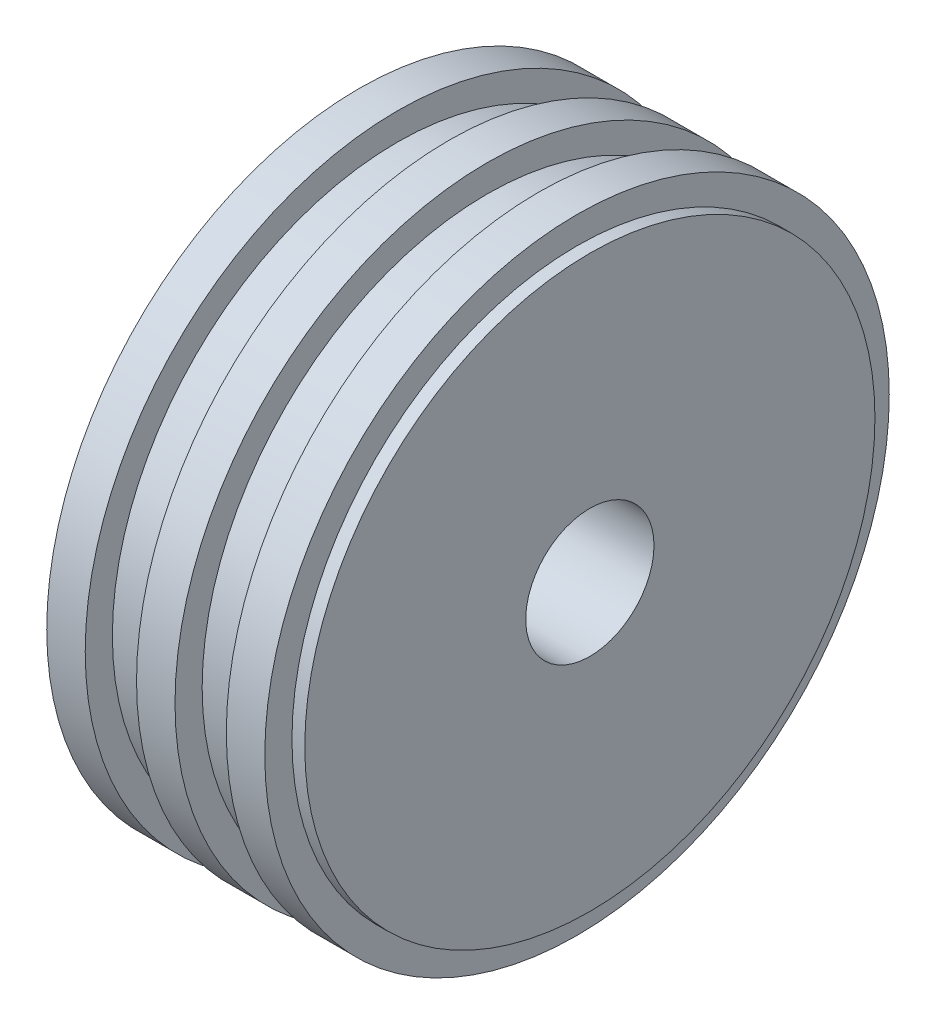
ISO-10303-21;
HEADER;
FILE_DESCRIPTION(('STEP AP214'),'2;1');
FILE_NAME('part.step','',(''),(''),'','','');
FILE_SCHEMA(('AUTOMOTIVE_DESIGN { 1 0 10303 214 1 1 1 1 }'));
ENDSEC;
DATA;
#1=APPLICATION_CONTEXT('core data for automotive mechanical design processes');
#2=APPLICATION_PROTOCOL_DEFINITION('international standard','automotive_design',2000,#1);
#3=PRODUCT_CONTEXT('',#1,'mechanical');
#4=PRODUCT('Part','Part','',(#3));
#5=PRODUCT_RELATED_PRODUCT_CATEGORY('part','',(#4));
#6=PRODUCT_DEFINITION_FORMATION('','',#4);
#7=PRODUCT_DEFINITION_CONTEXT('part definition',#1,'design');
#8=PRODUCT_DEFINITION('design','',#6,#7);
#9=PRODUCT_DEFINITION_SHAPE('','',#8);
#10=(LENGTH_UNIT() NAMED_UNIT(*) SI_UNIT(.MILLI.,.METRE.));
#11=(NAMED_UNIT(*) PLANE_ANGLE_UNIT() SI_UNIT($,.RADIAN.));
#12=(NAMED_UNIT(*) SI_UNIT($,.STERADIAN.) SOLID_ANGLE_UNIT());
#13=UNCERTAINTY_MEASURE_WITH_UNIT(LENGTH_MEASURE(1.E-05),#10,'distance_accuracy_value','');
#14=(GEOMETRIC_REPRESENTATION_CONTEXT(3) GLOBAL_UNCERTAINTY_ASSIGNED_CONTEXT((#13)) GLOBAL_UNIT_ASSIGNED_CONTEXT((#10,
#11,#12)) REPRESENTATION_CONTEXT('',''));
#15=CARTESIAN_POINT('',(0.,0.,0.));
#16=DIRECTION('',(0.,0.,1.));
#17=DIRECTION('',(1.,0.,0.));
#18=AXIS2_PLACEMENT_3D('',#15,#16,#17);
#19=CARTESIAN_POINT('',(0.,0.,0.));
#20=DIRECTION('',(1.,0.,0.));
#21=DIRECTION('',(0.,0.,-1.));
#22=AXIS2_PLACEMENT_3D('',#19,#20,#21);
#23=CYLINDRICAL_SURFACE('',#22,15.);
#24=CARTESIAN_POINT('',(0.,0.,0.));
#25=DIRECTION('',(1.,0.,0.));
#26=DIRECTION('',(0.,0.,-1.));
#27=AXIS2_PLACEMENT_3D('',#24,#25,#26);
#28=CIRCLE('',#27,15.);
#29=CARTESIAN_POINT('',(0.,0.,-15.));
#30=VERTEX_POINT('',#29);
#31=EDGE_CURVE('E89',#30,#30,#28,.T.);
#32=ORIENTED_EDGE('',*,*,#31,.T.);
#33=EDGE_LOOP('',(#32));
#34=FACE_BOUND('',#33,.T.);
#35=CARTESIAN_POINT('',(-57.,0.,0.));
#36=DIRECTION('',(1.,0.,0.));
#37=DIRECTION('',(0.,0.,-1.));
#38=AXIS2_PLACEMENT_3D('',#35,#36,#37);
#39=CIRCLE('',#38,15.);
#40=CARTESIAN_POINT('',(-57.,0.,-15.));
#41=VERTEX_POINT('',#40);
#42=EDGE_CURVE('E10',#41,#41,#39,.T.);
#43=ORIENTED_EDGE('',*,*,#42,.F.);
#44=EDGE_LOOP('',(#43));
#45=FACE_BOUND('',#44,.T.);
#46=ADVANCED_FACE('F37',(#34,#45),#23,.F.);
#47=CARTESIAN_POINT('',(-57.,0.,-15.));
#48=DIRECTION('',(-1.,0.,0.));
#49=DIRECTION('',(0.,0.,1.));
#50=AXIS2_PLACEMENT_3D('',#47,#48,#49);
#51=PLANE('',#50);
#52=ORIENTED_EDGE('',*,*,#42,.T.);
#53=EDGE_LOOP('',(#52));
#54=FACE_BOUND('',#53,.T.);
#55=CARTESIAN_POINT('',(-57.,0.,0.));
#56=DIRECTION('',(1.,0.,0.));
#57=DIRECTION('',(0.,0.,-1.));
#58=AXIS2_PLACEMENT_3D('',#55,#56,#57);
#59=CIRCLE('',#58,66.675);
#60=CARTESIAN_POINT('',(-57.,0.,-66.675));
#61=VERTEX_POINT('',#60);
#62=EDGE_CURVE('E43',#61,#61,#59,.T.);
#63=ORIENTED_EDGE('',*,*,#62,.F.);
#64=EDGE_LOOP('',(#63));
#65=FACE_BOUND('',#64,.T.);
#66=ADVANCED_FACE('F107',(#54,#65),#51,.T.);
#67=CARTESIAN_POINT('',(0.,0.,0.));
#68=DIRECTION('',(1.,0.,0.));
#69=DIRECTION('',(0.,0.,-1.));
#70=AXIS2_PLACEMENT_3D('',#67,#68,#69);
#71=CYLINDRICAL_SURFACE('',#70,66.675);
#72=ORIENTED_EDGE('',*,*,#62,.T.);
#73=EDGE_LOOP('',(#72));
#74=FACE_BOUND('',#73,.T.);
#75=CARTESIAN_POINT('',(-54.,0.,0.));
#76=DIRECTION('',(1.,0.,0.));
#77=DIRECTION('',(0.,0.,-1.));
#78=AXIS2_PLACEMENT_3D('',#75,#76,#77);
#79=CIRCLE('',#78,66.675);
#80=CARTESIAN_POINT('',(-54.,0.,-66.675));
#81=VERTEX_POINT('',#80);
#82=EDGE_CURVE('E47',#81,#81,#79,.T.);
#83=ORIENTED_EDGE('',*,*,#82,.F.);
#84=EDGE_LOOP('',(#83));
#85=FACE_BOUND('',#84,.T.);
#86=ADVANCED_FACE('F111',(#74,#85),#71,.T.);
#87=CARTESIAN_POINT('',(-54.,0.,-66.675));
#88=DIRECTION('',(-1.,0.,0.));
#89=DIRECTION('',(0.,0.,1.));
#90=AXIS2_PLACEMENT_3D('',#87,#88,#89);
#91=PLANE('',#90);
#92=ORIENTED_EDGE('',*,*,#82,.T.);
#93=EDGE_LOOP('',(#92));
#94=FACE_BOUND('',#93,.T.);
#95=CARTESIAN_POINT('',(-54.,0.,0.));
#96=DIRECTION('',(1.,0.,0.));
#97=DIRECTION('',(0.,0.,-1.));
#98=AXIS2_PLACEMENT_3D('',#95,#96,#97);
#99=CIRCLE('',#98,73.025);
#100=CARTESIAN_POINT('',(-54.,0.,-73.025));
#101=VERTEX_POINT('',#100);
#102=EDGE_CURVE('E51',#101,#101,#99,.T.);
#103=ORIENTED_EDGE('',*,*,#102,.F.);
#104=EDGE_LOOP('',(#103));
#105=FACE_BOUND('',#104,.T.);
#106=ADVANCED_FACE('F115',(#94,#105),#91,.T.);
#107=CARTESIAN_POINT('',(0.,0.,0.));
#108=DIRECTION('',(1.,0.,0.));
#109=DIRECTION('',(0.,0.,-1.));
#110=AXIS2_PLACEMENT_3D('',#107,#108,#109);
#111=CYLINDRICAL_SURFACE('',#110,73.025);
#112=ORIENTED_EDGE('',*,*,#102,.T.);
#113=EDGE_LOOP('',(#112));
#114=FACE_BOUND('',#113,.T.);
#115=CARTESIAN_POINT('',(-45.,0.,0.));
#116=DIRECTION('',(1.,0.,0.));
#117=DIRECTION('',(0.,0.,-1.));
#118=AXIS2_PLACEMENT_3D('',#115,#116,#117);
#119=CIRCLE('',#118,73.025);
#120=CARTESIAN_POINT('',(-45.,0.,-73.025));
#121=VERTEX_POINT('',#120);
#122=EDGE_CURVE('E56',#121,#121,#119,.T.);
#123=ORIENTED_EDGE('',*,*,#122,.F.);
#124=EDGE_LOOP('',(#123));
#125=FACE_BOUND('',#124,.T.);
#126=ADVANCED_FACE('F121',(#114,#125),#111,.T.);
#127=CARTESIAN_POINT('',(-45.,0.,-73.025));
#128=DIRECTION('',(1.,0.,0.));
#129=DIRECTION('',(0.,0.,-1.));
#130=AXIS2_PLACEMENT_3D('',#127,#128,#129);
#131=PLANE('',#130);
#132=ORIENTED_EDGE('',*,*,#122,.T.);
#133=EDGE_LOOP('',(#132));
#134=FACE_BOUND('',#133,.T.);
#135=CARTESIAN_POINT('',(-45.,0.,0.));
#136=DIRECTION('',(1.,0.,0.));
#137=DIRECTION('',(0.,0.,-1.));
#138=AXIS2_PLACEMENT_3D('',#135,#136,#137);
#139=CIRCLE('',#138,66.675);
#140=CARTESIAN_POINT('',(-45.,0.,-66.675));
#141=VERTEX_POINT('',#140);
#142=EDGE_CURVE('E59',#141,#141,#139,.T.);
#143=ORIENTED_EDGE('',*,*,#142,.F.);
#144=EDGE_LOOP('',(#143));
#145=FACE_BOUND('',#144,.T.);
#146=ADVANCED_FACE('F125',(#134,#145),#131,.T.);
#147=CARTESIAN_POINT('',(0.,0.,0.));
#148=DIRECTION('',(1.,0.,0.));
#149=DIRECTION('',(0.,0.,-1.));
#150=AXIS2_PLACEMENT_3D('',#147,#148,#149);
#151=CYLINDRICAL_SURFACE('',#150,66.675);
#152=ORIENTED_EDGE('',*,*,#142,.T.);
#153=EDGE_LOOP('',(#152));
#154=FACE_BOUND('',#153,.T.);
#155=CARTESIAN_POINT('',(-33.,0.,0.));
#156=DIRECTION('',(1.,0.,0.));
#157=DIRECTION('',(0.,0.,-1.));
#158=AXIS2_PLACEMENT_3D('',#155,#156,#157);
#159=CIRCLE('',#158,66.675);
#160=CARTESIAN_POINT('',(-33.,0.,-66.675));
#161=VERTEX_POINT('',#160);
#162=EDGE_CURVE('E62',#161,#161,#159,.T.);
#163=ORIENTED_EDGE('',*,*,#162,.F.);
#164=EDGE_LOOP('',(#163));
#165=FACE_BOUND('',#164,.T.);
#166=ADVANCED_FACE('F129',(#154,#165),#151,.T.);
#167=CARTESIAN_POINT('',(-33.,0.,-66.675));
#168=DIRECTION('',(-1.,0.,0.));
#169=DIRECTION('',(0.,0.,1.));
#170=AXIS2_PLACEMENT_3D('',#167,#168,#169);
#171=PLANE('',#170);
#172=ORIENTED_EDGE('',*,*,#162,.T.);
#173=EDGE_LOOP('',(#172));
#174=FACE_BOUND('',#173,.T.);
#175=CARTESIAN_POINT('',(-33.,0.,0.));
#176=DIRECTION('',(1.,0.,0.));
#177=DIRECTION('',(0.,0.,-1.));
#178=AXIS2_PLACEMENT_3D('',#175,#176,#177);
#179=CIRCLE('',#178,73.025);
#180=CARTESIAN_POINT('',(-33.,0.,-73.025));
#181=VERTEX_POINT('',#180);
#182=EDGE_CURVE('E65',#181,#181,#179,.T.);
#183=ORIENTED_EDGE('',*,*,#182,.F.);
#184=EDGE_LOOP('',(#183));
#185=FACE_BOUND('',#184,.T.);
#186=ADVANCED_FACE('F133',(#174,#185),#171,.T.);
#187=CARTESIAN_POINT('',(0.,0.,0.));
#188=DIRECTION('',(1.,0.,0.));
#189=DIRECTION('',(0.,0.,-1.));
#190=AXIS2_PLACEMENT_3D('',#187,#188,#189);
#191=CYLINDRICAL_SURFACE('',#190,73.025);
#192=ORIENTED_EDGE('',*,*,#182,.T.);
#193=EDGE_LOOP('',(#192));
#194=FACE_BOUND('',#193,.T.);
#195=CARTESIAN_POINT('',(-24.,0.,0.));
#196=DIRECTION('',(1.,0.,0.));
#197=DIRECTION('',(0.,0.,-1.));
#198=AXIS2_PLACEMENT_3D('',#195,#196,#197);
#199=CIRCLE('',#198,73.025);
#200=CARTESIAN_POINT('',(-24.,0.,-73.025));
#201=VERTEX_POINT('',#200);
#202=EDGE_CURVE('E68',#201,#201,#199,.T.);
#203=ORIENTED_EDGE('',*,*,#202,.F.);
#204=EDGE_LOOP('',(#203));
#205=FACE_BOUND('',#204,.T.);
#206=ADVANCED_FACE('F137',(#194,#205),#191,.T.);
#207=CARTESIAN_POINT('',(-24.,0.,-73.025));
#208=DIRECTION('',(1.,0.,0.));
#209=DIRECTION('',(0.,0.,-1.));
#210=AXIS2_PLACEMENT_3D('',#207,#208,#209);
#211=PLANE('',#210);
#212=ORIENTED_EDGE('',*,*,#202,.T.);
#213=EDGE_LOOP('',(#212));
#214=FACE_BOUND('',#213,.T.);
#215=CARTESIAN_POINT('',(-24.,0.,0.));
#216=DIRECTION('',(1.,0.,0.));
#217=DIRECTION('',(0.,0.,-1.));
#218=AXIS2_PLACEMENT_3D('',#215,#216,#217);
#219=CIRCLE('',#218,66.675);
#220=CARTESIAN_POINT('',(-24.,0.,-66.675));
#221=VERTEX_POINT('',#220);
#222=EDGE_CURVE('E71',#221,#221,#219,.T.);
#223=ORIENTED_EDGE('',*,*,#222,.F.);
#224=EDGE_LOOP('',(#223));
#225=FACE_BOUND('',#224,.T.);
#226=ADVANCED_FACE('F141',(#214,#225),#211,.T.);
#227=CARTESIAN_POINT('',(0.,0.,0.));
#228=DIRECTION('',(1.,0.,0.));
#229=DIRECTION('',(0.,0.,-1.));
#230=AXIS2_PLACEMENT_3D('',#227,#228,#229);
#231=CYLINDRICAL_SURFACE('',#230,66.675);
#232=ORIENTED_EDGE('',*,*,#222,.T.);
#233=EDGE_LOOP('',(#232));
#234=FACE_BOUND('',#233,.T.);
#235=CARTESIAN_POINT('',(-12.,0.,0.));
#236=DIRECTION('',(1.,0.,0.));
#237=DIRECTION('',(0.,0.,-1.));
#238=AXIS2_PLACEMENT_3D('',#235,#236,#237);
#239=CIRCLE('',#238,66.675);
#240=CARTESIAN_POINT('',(-12.,0.,-66.675));
#241=VERTEX_POINT('',#240);
#242=EDGE_CURVE('E74',#241,#241,#239,.T.);
#243=ORIENTED_EDGE('',*,*,#242,.F.);
#244=EDGE_LOOP('',(#243));
#245=FACE_BOUND('',#244,.T.);
#246=ADVANCED_FACE('F145',(#234,#245),#231,.T.);
#247=CARTESIAN_POINT('',(-12.,0.,-66.675));
#248=DIRECTION('',(-1.,0.,0.));
#249=DIRECTION('',(0.,0.,1.));
#250=AXIS2_PLACEMENT_3D('',#247,#248,#249);
#251=PLANE('',#250);
#252=ORIENTED_EDGE('',*,*,#242,.T.);
#253=EDGE_LOOP('',(#252));
#254=FACE_BOUND('',#253,.T.);
#255=CARTESIAN_POINT('',(-12.,0.,0.));
#256=DIRECTION('',(1.,0.,0.));
#257=DIRECTION('',(0.,0.,-1.));
#258=AXIS2_PLACEMENT_3D('',#255,#256,#257);
#259=CIRCLE('',#258,73.025);
#260=CARTESIAN_POINT('',(-12.,0.,-73.025));
#261=VERTEX_POINT('',#260);
#262=EDGE_CURVE('E77',#261,#261,#259,.T.);
#263=ORIENTED_EDGE('',*,*,#262,.F.);
#264=EDGE_LOOP('',(#263));
#265=FACE_BOUND('',#264,.T.);
#266=ADVANCED_FACE('F149',(#254,#265),#251,.T.);
#267=CARTESIAN_POINT('',(0.,0.,0.));
#268=DIRECTION('',(1.,0.,0.));
#269=DIRECTION('',(0.,0.,-1.));
#270=AXIS2_PLACEMENT_3D('',#267,#268,#269);
#271=CYLINDRICAL_SURFACE('',#270,73.025);
#272=ORIENTED_EDGE('',*,*,#262,.T.);
#273=EDGE_LOOP('',(#272));
#274=FACE_BOUND('',#273,.T.);
#275=CARTESIAN_POINT('',(-2.99999999999999,0.,0.));
#276=DIRECTION('',(1.,0.,0.));
#277=DIRECTION('',(0.,0.,-1.));
#278=AXIS2_PLACEMENT_3D('',#275,#276,#277);
#279=CIRCLE('',#278,73.025);
#280=CARTESIAN_POINT('',(-3.,0.,-73.025));
#281=VERTEX_POINT('',#280);
#282=EDGE_CURVE('E80',#281,#281,#279,.T.);
#283=ORIENTED_EDGE('',*,*,#282,.F.);
#284=EDGE_LOOP('',(#283));
#285=FACE_BOUND('',#284,.T.);
#286=ADVANCED_FACE('F153',(#274,#285),#271,.T.);
#287=CARTESIAN_POINT('',(-3.,0.,-73.025));
#288=DIRECTION('',(1.,0.,0.));
#289=DIRECTION('',(0.,0.,-1.));
#290=AXIS2_PLACEMENT_3D('',#287,#288,#289);
#291=PLANE('',#290);
#292=ORIENTED_EDGE('',*,*,#282,.T.);
#293=EDGE_LOOP('',(#292));
#294=FACE_BOUND('',#293,.T.);
#295=CARTESIAN_POINT('',(-2.99999999999999,0.,0.));
#296=DIRECTION('',(1.,0.,0.));
#297=DIRECTION('',(0.,0.,-1.));
#298=AXIS2_PLACEMENT_3D('',#295,#296,#297);
#299=CIRCLE('',#298,66.675);
#300=CARTESIAN_POINT('',(-3.,0.,-66.675));
#301=VERTEX_POINT('',#300);
#302=EDGE_CURVE('E83',#301,#301,#299,.T.);
#303=ORIENTED_EDGE('',*,*,#302,.F.);
#304=EDGE_LOOP('',(#303));
#305=FACE_BOUND('',#304,.T.);
#306=ADVANCED_FACE('F103',(#294,#305),#291,.T.);
#307=CARTESIAN_POINT('',(0.,0.,0.));
#308=DIRECTION('',(1.,0.,0.));
#309=DIRECTION('',(0.,0.,-1.));
#310=AXIS2_PLACEMENT_3D('',#307,#308,#309);
#311=CYLINDRICAL_SURFACE('',#310,66.675);
#312=ORIENTED_EDGE('',*,*,#302,.T.);
#313=EDGE_LOOP('',(#312));
#314=FACE_BOUND('',#313,.T.);
#315=CARTESIAN_POINT('',(0.,0.,0.));
#316=DIRECTION('',(1.,0.,0.));
#317=DIRECTION('',(0.,0.,-1.));
#318=AXIS2_PLACEMENT_3D('',#315,#316,#317);
#319=CIRCLE('',#318,66.675);
#320=CARTESIAN_POINT('',(0.,0.,-66.675));
#321=VERTEX_POINT('',#320);
#322=EDGE_CURVE('E86',#321,#321,#319,.T.);
#323=ORIENTED_EDGE('',*,*,#322,.F.);
#324=EDGE_LOOP('',(#323));
#325=FACE_BOUND('',#324,.T.);
#326=ADVANCED_FACE('F97',(#314,#325),#311,.T.);
#327=CARTESIAN_POINT('',(0.,0.,-66.675));
#328=DIRECTION('',(1.,0.,0.));
#329=DIRECTION('',(0.,0.,-1.));
#330=AXIS2_PLACEMENT_3D('',#327,#328,#329);
#331=PLANE('',#330);
#332=ORIENTED_EDGE('',*,*,#322,.T.);
#333=EDGE_LOOP('',(#332));
#334=FACE_BOUND('',#333,.T.);
#335=ORIENTED_EDGE('',*,*,#31,.F.);
#336=EDGE_LOOP('',(#335));
#337=FACE_BOUND('',#336,.T.);
#338=ADVANCED_FACE('F95',(#334,#337),#331,.T.);
#339=CLOSED_SHELL('',(#46,#66,#86,#106,#126,#146,#166,#186,#206,#226,#246,#266,#286,#306,#326,#338));
#340=MANIFOLD_SOLID_BREP('B2',#339);
#341=ADVANCED_BREP_SHAPE_REPRESENTATION('',(#18,#340),#14);
#342=SHAPE_DEFINITION_REPRESENTATION(#9,#341);
ENDSEC;
END-ISO-10303-21;
